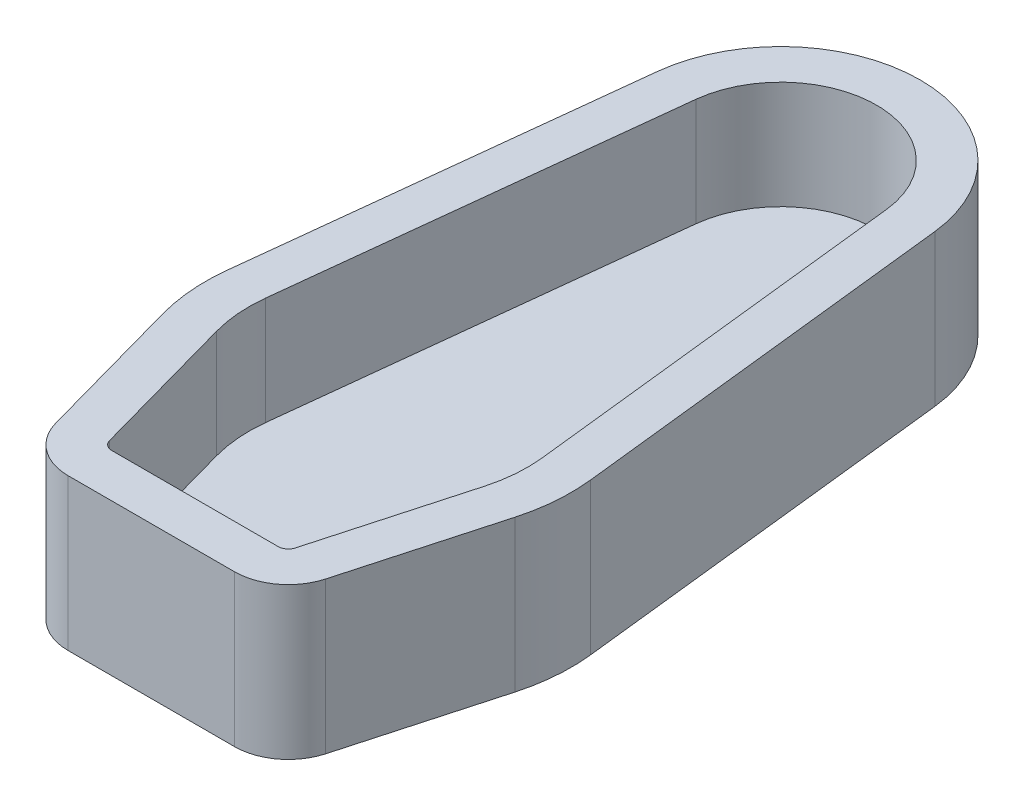
ISO-10303-21;
HEADER;
FILE_DESCRIPTION(('STEP AP214'),'2;1');
FILE_NAME('part.step','',(''),(''),'','','');
FILE_SCHEMA(('AUTOMOTIVE_DESIGN { 1 0 10303 214 1 1 1 1 }'));
ENDSEC;
DATA;
#1=APPLICATION_CONTEXT('core data for automotive mechanical design processes');
#2=APPLICATION_PROTOCOL_DEFINITION('international standard','automotive_design',2000,#1);
#3=PRODUCT_CONTEXT('',#1,'mechanical');
#4=PRODUCT('Part','Part','',(#3));
#5=PRODUCT_RELATED_PRODUCT_CATEGORY('part','',(#4));
#6=PRODUCT_DEFINITION_FORMATION('','',#4);
#7=PRODUCT_DEFINITION_CONTEXT('part definition',#1,'design');
#8=PRODUCT_DEFINITION('design','',#6,#7);
#9=PRODUCT_DEFINITION_SHAPE('','',#8);
#10=(LENGTH_UNIT() NAMED_UNIT(*) SI_UNIT(.MILLI.,.METRE.));
#11=(NAMED_UNIT(*) PLANE_ANGLE_UNIT() SI_UNIT($,.RADIAN.));
#12=(NAMED_UNIT(*) SI_UNIT($,.STERADIAN.) SOLID_ANGLE_UNIT());
#13=UNCERTAINTY_MEASURE_WITH_UNIT(LENGTH_MEASURE(1.E-05),#10,'distance_accuracy_value','');
#14=(GEOMETRIC_REPRESENTATION_CONTEXT(3) GLOBAL_UNCERTAINTY_ASSIGNED_CONTEXT((#13)) GLOBAL_UNIT_ASSIGNED_CONTEXT((#10,
#11,#12)) REPRESENTATION_CONTEXT('',''));
#15=CARTESIAN_POINT('',(0.,0.,0.));
#16=DIRECTION('',(0.,0.,1.));
#17=DIRECTION('',(1.,0.,0.));
#18=AXIS2_PLACEMENT_3D('',#15,#16,#17);
#19=CARTESIAN_POINT('',(0.,7.5,-14.5));
#20=DIRECTION('',(0.,-1.,0.));
#21=DIRECTION('',(0.,0.,-1.));
#22=AXIS2_PLACEMENT_3D('',#19,#20,#21);
#23=CYLINDRICAL_SURFACE('',#22,6.91000000000001);
#24=CARTESIAN_POINT('',(0.,0.,-14.5));
#25=DIRECTION('',(0.,1.,0.));
#26=DIRECTION('',(0.,0.,1.));
#27=AXIS2_PLACEMENT_3D('',#24,#25,#26);
#28=CIRCLE('',#27,6.91000000000001);
#29=CARTESIAN_POINT('',(6.86778996272424,0.,-15.2626014869535));
#30=VERTEX_POINT('',#29);
#31=CARTESIAN_POINT('',(-6.86778996272433,0.,-15.2626014869535));
#32=VERTEX_POINT('',#31);
#33=EDGE_CURVE('E154',#30,#32,#28,.T.);
#34=ORIENTED_EDGE('',*,*,#33,.T.);
#35=DIRECTION('',(0.,-1.,0.));
#36=VECTOR('',#35,1.);
#37=CARTESIAN_POINT('',(-6.86778996272433,7.5,-15.2626014869535));
#38=LINE('',#37,#36);
#39=CARTESIAN_POINT('',(-6.86778996272433,7.5,-15.2626014869535));
#40=VERTEX_POINT('',#39);
#41=EDGE_CURVE('E11',#40,#32,#38,.T.);
#42=ORIENTED_EDGE('',*,*,#41,.F.);
#43=CARTESIAN_POINT('',(0.,7.5,-14.5));
#44=DIRECTION('',(0.,1.,0.));
#45=DIRECTION('',(0.,0.,1.));
#46=AXIS2_PLACEMENT_3D('',#43,#44,#45);
#47=CIRCLE('',#46,6.91000000000001);
#48=CARTESIAN_POINT('',(6.86778996272424,7.5,-15.2626014869535));
#49=VERTEX_POINT('',#48);
#50=EDGE_CURVE('E178',#49,#40,#47,.T.);
#51=ORIENTED_EDGE('',*,*,#50,.F.);
#52=DIRECTION('',(0.,-1.,0.));
#53=VECTOR('',#52,1.);
#54=CARTESIAN_POINT('',(6.86778996272424,7.5,-15.2626014869535));
#55=LINE('',#54,#53);
#56=EDGE_CURVE('E56',#49,#30,#55,.T.);
#57=ORIENTED_EDGE('',*,*,#56,.T.);
#58=EDGE_LOOP('',(#34,#42,#51,#57));
#59=FACE_BOUND('',#58,.T.);
#60=ADVANCED_FACE('F33',(#59),#23,.T.);
#61=CARTESIAN_POINT('',(-6.86778996272433,7.5,-15.2626014869535));
#62=DIRECTION('',(0.993891456255322,0.,0.110362009689359));
#63=DIRECTION('',(0.110362009689359,0.,-0.993891456255323));
#64=AXIS2_PLACEMENT_3D('',#61,#62,#63);
#65=PLANE('',#64);
#66=DIRECTION('',(-0.110362009689359,0.,0.993891456255322));
#67=VECTOR('',#66,1.);
#68=CARTESIAN_POINT('',(-6.86778996272433,0.,-15.2626014869535));
#69=LINE('',#68,#67);
#70=CARTESIAN_POINT('',(-8.99761732756001,0.,3.91806790432763));
#71=VERTEX_POINT('',#70);
#72=EDGE_CURVE('E156',#32,#71,#69,.T.);
#73=ORIENTED_EDGE('',*,*,#72,.T.);
#74=DIRECTION('',(0.,-1.,0.));
#75=VECTOR('',#74,1.);
#76=CARTESIAN_POINT('',(-8.99761732756001,7.5,3.91806790432763));
#77=LINE('',#76,#75);
#78=CARTESIAN_POINT('',(-8.99761732756001,7.5,3.91806790432763));
#79=VERTEX_POINT('',#78);
#80=EDGE_CURVE('E40',#79,#71,#77,.T.);
#81=ORIENTED_EDGE('',*,*,#80,.F.);
#82=DIRECTION('',(-0.110362009689359,0.,0.993891456255322));
#83=VECTOR('',#82,1.);
#84=CARTESIAN_POINT('',(-6.86778996272433,7.5,-15.2626014869535));
#85=LINE('',#84,#83);
#86=EDGE_CURVE('E101',#40,#79,#85,.T.);
#87=ORIENTED_EDGE('',*,*,#86,.F.);
#88=ORIENTED_EDGE('',*,*,#41,.T.);
#89=EDGE_LOOP('',(#73,#81,#87,#88));
#90=FACE_BOUND('',#89,.T.);
#91=ADVANCED_FACE('F226',(#90),#65,.F.);
#92=CARTESIAN_POINT('',(0.106428411738743,7.5,4.92898391308223));
#93=DIRECTION('',(0.,-1.,0.));
#94=DIRECTION('',(0.,0.,-1.));
#95=AXIS2_PLACEMENT_3D('',#92,#93,#94);
#96=CYLINDRICAL_SURFACE('',#95,9.16);
#97=CARTESIAN_POINT('',(0.106428411738743,0.,4.92898391308223));
#98=DIRECTION('',(0.,1.,0.));
#99=DIRECTION('',(0.,0.,1.));
#100=AXIS2_PLACEMENT_3D('',#97,#98,#99);
#101=CIRCLE('',#100,9.16);
#102=CARTESIAN_POINT('',(-8.71939564047149,0.,7.38060170536294));
#103=VERTEX_POINT('',#102);
#104=EDGE_CURVE('E159',#71,#103,#101,.T.);
#105=ORIENTED_EDGE('',*,*,#104,.T.);
#106=DIRECTION('',(0.,-1.,0.));
#107=VECTOR('',#106,1.);
#108=CARTESIAN_POINT('',(-8.71939564047149,7.5,7.38060170536294));
#109=LINE('',#108,#107);
#110=CARTESIAN_POINT('',(-8.71939564047149,7.5,7.38060170536294));
#111=VERTEX_POINT('',#110);
#112=EDGE_CURVE('E189',#111,#103,#109,.T.);
#113=ORIENTED_EDGE('',*,*,#112,.F.);
#114=CARTESIAN_POINT('',(0.106428411738743,7.5,4.92898391308223));
#115=DIRECTION('',(0.,1.,0.));
#116=DIRECTION('',(0.,0.,1.));
#117=AXIS2_PLACEMENT_3D('',#114,#115,#116);
#118=CIRCLE('',#117,9.16);
#119=EDGE_CURVE('E196',#79,#111,#118,.T.);
#120=ORIENTED_EDGE('',*,*,#119,.F.);
#121=ORIENTED_EDGE('',*,*,#80,.T.);
#122=EDGE_LOOP('',(#105,#113,#120,#121));
#123=FACE_BOUND('',#122,.T.);
#124=ADVANCED_FACE('F194',(#123),#96,.T.);
#125=CARTESIAN_POINT('',(-6.68291481483034,7.5,14.711932677671));
#126=DIRECTION('',(-0.96351790962994,0.,0.267643863786098));
#127=DIRECTION('',(0.267643863786098,0.,0.96351790962994));
#128=AXIS2_PLACEMENT_3D('',#125,#126,#127);
#129=PLANE('',#128);
#130=DIRECTION('',(-0.267643863786098,0.,-0.96351790962994));
#131=VECTOR('',#130,1.);
#132=CARTESIAN_POINT('',(-6.68291481483034,0.,14.711932677671));
#133=LINE('',#132,#131);
#134=CARTESIAN_POINT('',(-6.68291481483034,0.,14.711932677671));
#135=VERTEX_POINT('',#134);
#136=EDGE_CURVE('E162',#135,#103,#133,.T.);
#137=ORIENTED_EDGE('',*,*,#136,.F.);
#138=DIRECTION('',(0.,-1.,0.));
#139=VECTOR('',#138,1.);
#140=CARTESIAN_POINT('',(-6.68291481483034,7.5,14.711932677671));
#141=LINE('',#140,#139);
#142=CARTESIAN_POINT('',(-6.68291481483034,7.5,14.711932677671));
#143=VERTEX_POINT('',#142);
#144=EDGE_CURVE('E187',#143,#135,#141,.T.);
#145=ORIENTED_EDGE('',*,*,#144,.F.);
#146=DIRECTION('',(-0.267643863786098,0.,-0.96351790962994));
#147=VECTOR('',#146,1.);
#148=CARTESIAN_POINT('',(-6.68291481483034,7.5,14.711932677671));
#149=LINE('',#148,#147);
#150=EDGE_CURVE('E206',#143,#111,#149,.T.);
#151=ORIENTED_EDGE('',*,*,#150,.T.);
#152=ORIENTED_EDGE('',*,*,#112,.T.);
#153=EDGE_LOOP('',(#137,#145,#151,#152));
#154=FACE_BOUND('',#153,.T.);
#155=ADVANCED_FACE('F203',(#154),#129,.T.);
#156=CARTESIAN_POINT('',(-4.11995717521469,7.5,14.));
#157=DIRECTION('',(0.,-1.,0.));
#158=DIRECTION('',(0.,0.,-1.));
#159=AXIS2_PLACEMENT_3D('',#156,#157,#158);
#160=CYLINDRICAL_SURFACE('',#159,2.66);
#161=CARTESIAN_POINT('',(-4.11995717521469,0.,14.));
#162=DIRECTION('',(0.,-1.,0.));
#163=DIRECTION('',(0.,0.,-1.));
#164=AXIS2_PLACEMENT_3D('',#161,#162,#163);
#165=CIRCLE('',#164,2.66);
#166=CARTESIAN_POINT('',(-4.11995717521468,0.,16.66));
#167=VERTEX_POINT('',#166);
#168=EDGE_CURVE('E165',#167,#135,#165,.T.);
#169=ORIENTED_EDGE('',*,*,#168,.F.);
#170=DIRECTION('',(0.,-1.,0.));
#171=VECTOR('',#170,1.);
#172=CARTESIAN_POINT('',(-4.11995717521468,7.5,16.66));
#173=LINE('',#172,#171);
#174=CARTESIAN_POINT('',(-4.11995717521468,7.5,16.66));
#175=VERTEX_POINT('',#174);
#176=EDGE_CURVE('E185',#175,#167,#173,.T.);
#177=ORIENTED_EDGE('',*,*,#176,.F.);
#178=CARTESIAN_POINT('',(-4.11995717521469,7.5,14.));
#179=DIRECTION('',(0.,-1.,0.));
#180=DIRECTION('',(0.,0.,-1.));
#181=AXIS2_PLACEMENT_3D('',#178,#179,#180);
#182=CIRCLE('',#181,2.66);
#183=EDGE_CURVE('E209',#175,#143,#182,.T.);
#184=ORIENTED_EDGE('',*,*,#183,.T.);
#185=ORIENTED_EDGE('',*,*,#144,.T.);
#186=EDGE_LOOP('',(#169,#177,#184,#185));
#187=FACE_BOUND('',#186,.T.);
#188=ADVANCED_FACE('F236',(#187),#160,.T.);
#189=CARTESIAN_POINT('',(-4.11995717521468,7.5,16.66));
#190=DIRECTION('',(0.,0.,-1.));
#191=DIRECTION('',(-1.,0.,0.));
#192=AXIS2_PLACEMENT_3D('',#189,#190,#191);
#193=PLANE('',#192);
#194=DIRECTION('',(1.,0.,0.));
#195=VECTOR('',#194,1.);
#196=CARTESIAN_POINT('',(-4.11995717521468,0.,16.66));
#197=LINE('',#196,#195);
#198=CARTESIAN_POINT('',(4.11995717521476,0.,16.66));
#199=VERTEX_POINT('',#198);
#200=EDGE_CURVE('E168',#167,#199,#197,.T.);
#201=ORIENTED_EDGE('',*,*,#200,.T.);
#202=DIRECTION('',(0.,-1.,0.));
#203=VECTOR('',#202,1.);
#204=CARTESIAN_POINT('',(4.11995717521476,7.5,16.66));
#205=LINE('',#204,#203);
#206=CARTESIAN_POINT('',(4.11995717521476,7.5,16.66));
#207=VERTEX_POINT('',#206);
#208=EDGE_CURVE('E182',#207,#199,#205,.T.);
#209=ORIENTED_EDGE('',*,*,#208,.F.);
#210=DIRECTION('',(1.,0.,0.));
#211=VECTOR('',#210,1.);
#212=CARTESIAN_POINT('',(-4.11995717521468,7.5,16.66));
#213=LINE('',#212,#211);
#214=EDGE_CURVE('E211',#175,#207,#213,.T.);
#215=ORIENTED_EDGE('',*,*,#214,.F.);
#216=ORIENTED_EDGE('',*,*,#176,.T.);
#217=EDGE_LOOP('',(#201,#209,#215,#216));
#218=FACE_BOUND('',#217,.T.);
#219=ADVANCED_FACE('F219',(#218),#193,.F.);
#220=CARTESIAN_POINT('',(4.11995717521479,7.5,14.));
#221=DIRECTION('',(0.,-1.,0.));
#222=DIRECTION('',(0.,0.,-1.));
#223=AXIS2_PLACEMENT_3D('',#220,#221,#222);
#224=CYLINDRICAL_SURFACE('',#223,2.66);
#225=CARTESIAN_POINT('',(4.11995717521479,0.,14.));
#226=DIRECTION('',(0.,1.,0.));
#227=DIRECTION('',(0.,0.,1.));
#228=AXIS2_PLACEMENT_3D('',#225,#226,#227);
#229=CIRCLE('',#228,2.66);
#230=CARTESIAN_POINT('',(6.68291481483043,0.,14.711932677671));
#231=VERTEX_POINT('',#230);
#232=EDGE_CURVE('E170',#199,#231,#229,.T.);
#233=ORIENTED_EDGE('',*,*,#232,.T.);
#234=DIRECTION('',(0.,-1.,0.));
#235=VECTOR('',#234,1.);
#236=CARTESIAN_POINT('',(6.68291481483043,7.5,14.711932677671));
#237=LINE('',#236,#235);
#238=CARTESIAN_POINT('',(6.68291481483043,7.5,14.711932677671));
#239=VERTEX_POINT('',#238);
#240=EDGE_CURVE('E145',#239,#231,#237,.T.);
#241=ORIENTED_EDGE('',*,*,#240,.F.);
#242=CARTESIAN_POINT('',(4.11995717521479,7.5,14.));
#243=DIRECTION('',(0.,1.,0.));
#244=DIRECTION('',(0.,0.,1.));
#245=AXIS2_PLACEMENT_3D('',#242,#243,#244);
#246=CIRCLE('',#245,2.66);
#247=EDGE_CURVE('E132',#207,#239,#246,.T.);
#248=ORIENTED_EDGE('',*,*,#247,.F.);
#249=ORIENTED_EDGE('',*,*,#208,.T.);
#250=EDGE_LOOP('',(#233,#241,#248,#249));
#251=FACE_BOUND('',#250,.T.);
#252=ADVANCED_FACE('F222',(#251),#224,.T.);
#253=CARTESIAN_POINT('',(6.68291481483043,7.5,14.711932677671));
#254=DIRECTION('',(-0.963517909629941,0.,-0.267643863786092));
#255=DIRECTION('',(-0.267643863786092,0.,0.963517909629941));
#256=AXIS2_PLACEMENT_3D('',#253,#254,#255);
#257=PLANE('',#256);
#258=DIRECTION('',(0.267643863786092,0.,-0.963517909629941));
#259=VECTOR('',#258,1.);
#260=CARTESIAN_POINT('',(6.68291481483043,0.,14.711932677671));
#261=LINE('',#260,#259);
#262=CARTESIAN_POINT('',(8.71939564047153,0.,7.38060170536297));
#263=VERTEX_POINT('',#262);
#264=EDGE_CURVE('E141',#231,#263,#261,.T.);
#265=ORIENTED_EDGE('',*,*,#264,.T.);
#266=DIRECTION('',(0.,-1.,0.));
#267=VECTOR('',#266,1.);
#268=CARTESIAN_POINT('',(8.71939564047153,7.5,7.38060170536297));
#269=LINE('',#268,#267);
#270=CARTESIAN_POINT('',(8.71939564047153,7.5,7.38060170536297));
#271=VERTEX_POINT('',#270);
#272=EDGE_CURVE('E138',#271,#263,#269,.T.);
#273=ORIENTED_EDGE('',*,*,#272,.F.);
#274=DIRECTION('',(0.267643863786092,0.,-0.963517909629941));
#275=VECTOR('',#274,1.);
#276=CARTESIAN_POINT('',(6.68291481483043,7.5,14.711932677671));
#277=LINE('',#276,#275);
#278=EDGE_CURVE('E124',#239,#271,#277,.T.);
#279=ORIENTED_EDGE('',*,*,#278,.F.);
#280=ORIENTED_EDGE('',*,*,#240,.T.);
#281=EDGE_LOOP('',(#265,#273,#279,#280));
#282=FACE_BOUND('',#281,.T.);
#283=ADVANCED_FACE('F139',(#282),#257,.F.);
#284=CARTESIAN_POINT('',(-0.106428411738709,7.5,4.92898391308228));
#285=DIRECTION('',(0.,-1.,0.));
#286=DIRECTION('',(0.,0.,-1.));
#287=AXIS2_PLACEMENT_3D('',#284,#285,#286);
#288=CYLINDRICAL_SURFACE('',#287,9.16);
#289=CARTESIAN_POINT('',(-0.106428411738709,0.,4.92898391308228));
#290=DIRECTION('',(0.,1.,0.));
#291=DIRECTION('',(0.,0.,1.));
#292=AXIS2_PLACEMENT_3D('',#289,#290,#291);
#293=CIRCLE('',#292,9.16);
#294=CARTESIAN_POINT('',(8.99761732756004,0.,3.91806790432761));
#295=VERTEX_POINT('',#294);
#296=EDGE_CURVE('E173',#263,#295,#293,.T.);
#297=ORIENTED_EDGE('',*,*,#296,.T.);
#298=DIRECTION('',(0.,-1.,0.));
#299=VECTOR('',#298,1.);
#300=CARTESIAN_POINT('',(8.99761732756004,7.5,3.91806790432761));
#301=LINE('',#300,#299);
#302=CARTESIAN_POINT('',(8.99761732756004,7.5,3.91806790432761));
#303=VERTEX_POINT('',#302);
#304=EDGE_CURVE('E146',#303,#295,#301,.T.);
#305=ORIENTED_EDGE('',*,*,#304,.F.);
#306=CARTESIAN_POINT('',(-0.106428411738709,7.5,4.92898391308228));
#307=DIRECTION('',(0.,1.,0.));
#308=DIRECTION('',(0.,0.,1.));
#309=AXIS2_PLACEMENT_3D('',#306,#307,#308);
#310=CIRCLE('',#309,9.16);
#311=EDGE_CURVE('E129',#271,#303,#310,.T.);
#312=ORIENTED_EDGE('',*,*,#311,.F.);
#313=ORIENTED_EDGE('',*,*,#272,.T.);
#314=EDGE_LOOP('',(#297,#305,#312,#313));
#315=FACE_BOUND('',#314,.T.);
#316=ADVANCED_FACE('F148',(#315),#288,.T.);
#317=CARTESIAN_POINT('',(6.86778996272424,7.5,-15.2626014869535));
#318=DIRECTION('',(0.993891456255322,0.,-0.110362009689366));
#319=DIRECTION('',(-0.110362009689366,0.,-0.993891456255322));
#320=AXIS2_PLACEMENT_3D('',#317,#318,#319);
#321=PLANE('',#320);
#322=DIRECTION('',(0.110362009689366,0.,0.993891456255322));
#323=VECTOR('',#322,1.);
#324=CARTESIAN_POINT('',(6.86778996272424,0.,-15.2626014869535));
#325=LINE('',#324,#323);
#326=EDGE_CURVE('E175',#30,#295,#325,.T.);
#327=ORIENTED_EDGE('',*,*,#326,.F.);
#328=ORIENTED_EDGE('',*,*,#56,.F.);
#329=DIRECTION('',(0.110362009689366,0.,0.993891456255322));
#330=VECTOR('',#329,1.);
#331=CARTESIAN_POINT('',(6.86778996272424,7.5,-15.2626014869535));
#332=LINE('',#331,#330);
#333=EDGE_CURVE('E149',#49,#303,#332,.T.);
#334=ORIENTED_EDGE('',*,*,#333,.T.);
#335=ORIENTED_EDGE('',*,*,#304,.T.);
#336=EDGE_LOOP('',(#327,#328,#334,#335));
#337=FACE_BOUND('',#336,.T.);
#338=ADVANCED_FACE('F223',(#337),#321,.T.);
#339=CARTESIAN_POINT('',(0.,7.5,-14.5));
#340=DIRECTION('',(0.,1.,0.));
#341=DIRECTION('',(0.,0.,1.));
#342=AXIS2_PLACEMENT_3D('',#339,#340,#341);
#343=PLANE('',#342);
#344=CARTESIAN_POINT('',(0.,7.5,-14.5));
#345=DIRECTION('',(0.,1.,0.));
#346=DIRECTION('',(0.,0.,1.));
#347=AXIS2_PLACEMENT_3D('',#344,#345,#346);
#348=CIRCLE('',#347,4.75000000000001);
#349=CARTESIAN_POINT('',(4.72098441721274,7.5,-15.0242195460245));
#350=VERTEX_POINT('',#349);
#351=CARTESIAN_POINT('',(-4.72098441721284,7.5,-15.0242195460245));
#352=VERTEX_POINT('',#351);
#353=EDGE_CURVE('E322',#350,#352,#348,.T.);
#354=ORIENTED_EDGE('',*,*,#353,.F.);
#355=DIRECTION('',(0.110362009689366,0.,0.993891456255322));
#356=VECTOR('',#355,1.);
#357=CARTESIAN_POINT('',(4.72098441721274,7.5,-15.0242195460245));
#358=LINE('',#357,#356);
#359=CARTESIAN_POINT('',(6.85081178204854,7.5,4.15644984525666));
#360=VERTEX_POINT('',#359);
#361=EDGE_CURVE('E352',#350,#360,#358,.T.);
#362=ORIENTED_EDGE('',*,*,#361,.T.);
#363=CARTESIAN_POINT('',(-0.106428411738709,7.5,4.92898391308228));
#364=DIRECTION('',(0.,1.,0.));
#365=DIRECTION('',(0.,0.,1.));
#366=AXIS2_PLACEMENT_3D('',#363,#364,#365);
#367=CIRCLE('',#366,7.);
#368=CARTESIAN_POINT('',(6.63819695567085,7.5,6.80249095958501));
#369=VERTEX_POINT('',#368);
#370=EDGE_CURVE('E350',#369,#360,#367,.T.);
#371=ORIENTED_EDGE('',*,*,#370,.F.);
#372=DIRECTION('',(0.267643863786092,0.,-0.963517909629941));
#373=VECTOR('',#372,1.);
#374=CARTESIAN_POINT('',(4.60171613002976,7.5,14.133821931893));
#375=LINE('',#374,#373);
#376=CARTESIAN_POINT('',(4.60171613002976,7.5,14.133821931893));
#377=VERTEX_POINT('',#376);
#378=EDGE_CURVE('E347',#377,#369,#375,.T.);
#379=ORIENTED_EDGE('',*,*,#378,.F.);
#380=CARTESIAN_POINT('',(4.11995717521479,7.5,14.));
#381=DIRECTION('',(0.,1.,0.));
#382=DIRECTION('',(0.,0.,1.));
#383=AXIS2_PLACEMENT_3D('',#380,#381,#382);
#384=CIRCLE('',#383,0.500000000000001);
#385=CARTESIAN_POINT('',(4.11995717521476,7.5,14.5));
#386=VERTEX_POINT('',#385);
#387=EDGE_CURVE('E344',#386,#377,#384,.T.);
#388=ORIENTED_EDGE('',*,*,#387,.F.);
#389=DIRECTION('',(1.,0.,0.));
#390=VECTOR('',#389,1.);
#391=CARTESIAN_POINT('',(-4.11995717521468,7.5,14.5));
#392=LINE('',#391,#390);
#393=CARTESIAN_POINT('',(-4.11995717521469,7.5,14.5));
#394=VERTEX_POINT('',#393);
#395=EDGE_CURVE('E341',#394,#386,#392,.T.);
#396=ORIENTED_EDGE('',*,*,#395,.F.);
#397=CARTESIAN_POINT('',(-4.11995717521469,7.5,14.));
#398=DIRECTION('',(0.,1.,0.));
#399=DIRECTION('',(0.,0.,1.));
#400=AXIS2_PLACEMENT_3D('',#397,#398,#399);
#401=CIRCLE('',#400,0.500000000000001);
#402=CARTESIAN_POINT('',(-4.60171613002967,7.5,14.133821931893));
#403=VERTEX_POINT('',#402);
#404=EDGE_CURVE('E338',#394,#403,#401,.F.);
#405=ORIENTED_EDGE('',*,*,#404,.T.);
#406=DIRECTION('',(-0.267643863786098,0.,-0.96351790962994));
#407=VECTOR('',#406,1.);
#408=CARTESIAN_POINT('',(-4.60171613002967,7.5,14.133821931893));
#409=LINE('',#408,#407);
#410=CARTESIAN_POINT('',(-6.63819695567082,7.5,6.80249095958496));
#411=VERTEX_POINT('',#410);
#412=EDGE_CURVE('E335',#403,#411,#409,.T.);
#413=ORIENTED_EDGE('',*,*,#412,.T.);
#414=CARTESIAN_POINT('',(0.106428411738743,7.5,4.92898391308223));
#415=DIRECTION('',(0.,1.,0.));
#416=DIRECTION('',(0.,0.,1.));
#417=AXIS2_PLACEMENT_3D('',#414,#415,#416);
#418=CIRCLE('',#417,7.);
#419=CARTESIAN_POINT('',(-6.85081178204851,7.5,4.15644984525665));
#420=VERTEX_POINT('',#419);
#421=EDGE_CURVE('E332',#420,#411,#418,.T.);
#422=ORIENTED_EDGE('',*,*,#421,.F.);
#423=DIRECTION('',(-0.110362009689359,0.,0.993891456255323));
#424=VECTOR('',#423,1.);
#425=CARTESIAN_POINT('',(-4.72098441721284,7.5,-15.0242195460245));
#426=LINE('',#425,#424);
#427=EDGE_CURVE('E324',#352,#420,#426,.T.);
#428=ORIENTED_EDGE('',*,*,#427,.F.);
#429=EDGE_LOOP('',(#354,#362,#371,#379,#388,#396,#405,#413,#422,#428));
#430=FACE_BOUND('',#429,.T.);
#431=ORIENTED_EDGE('',*,*,#50,.T.);
#432=ORIENTED_EDGE('',*,*,#86,.T.);
#433=ORIENTED_EDGE('',*,*,#119,.T.);
#434=ORIENTED_EDGE('',*,*,#150,.F.);
#435=ORIENTED_EDGE('',*,*,#183,.F.);
#436=ORIENTED_EDGE('',*,*,#214,.T.);
#437=ORIENTED_EDGE('',*,*,#247,.T.);
#438=ORIENTED_EDGE('',*,*,#278,.T.);
#439=ORIENTED_EDGE('',*,*,#311,.T.);
#440=ORIENTED_EDGE('',*,*,#333,.F.);
#441=EDGE_LOOP('',(#431,#432,#433,#434,#435,#436,#437,#438,#439,#440));
#442=FACE_BOUND('',#441,.T.);
#443=ADVANCED_FACE('F126',(#430,#442),#343,.T.);
#444=CARTESIAN_POINT('',(0.,0.,-14.5));
#445=DIRECTION('',(0.,1.,0.));
#446=DIRECTION('',(0.,0.,1.));
#447=AXIS2_PLACEMENT_3D('',#444,#445,#446);
#448=PLANE('',#447);
#449=ORIENTED_EDGE('',*,*,#33,.F.);
#450=ORIENTED_EDGE('',*,*,#326,.T.);
#451=ORIENTED_EDGE('',*,*,#296,.F.);
#452=ORIENTED_EDGE('',*,*,#264,.F.);
#453=ORIENTED_EDGE('',*,*,#232,.F.);
#454=ORIENTED_EDGE('',*,*,#200,.F.);
#455=ORIENTED_EDGE('',*,*,#168,.T.);
#456=ORIENTED_EDGE('',*,*,#136,.T.);
#457=ORIENTED_EDGE('',*,*,#104,.F.);
#458=ORIENTED_EDGE('',*,*,#72,.F.);
#459=EDGE_LOOP('',(#449,#450,#451,#452,#453,#454,#455,#456,#457,#458));
#460=FACE_BOUND('',#459,.T.);
#461=ADVANCED_FACE('F198',(#460),#448,.F.);
#462=CARTESIAN_POINT('',(0.,7.5,-14.5));
#463=DIRECTION('',(0.,-1.,0.));
#464=DIRECTION('',(0.,0.,-1.));
#465=AXIS2_PLACEMENT_3D('',#462,#463,#464);
#466=CYLINDRICAL_SURFACE('',#465,4.75000000000001);
#467=CARTESIAN_POINT('',(0.,2.16,-14.5));
#468=DIRECTION('',(0.,1.,0.));
#469=DIRECTION('',(0.,0.,1.));
#470=AXIS2_PLACEMENT_3D('',#467,#468,#469);
#471=CIRCLE('',#470,4.75000000000001);
#472=CARTESIAN_POINT('',(4.72098441721274,2.16,-15.0242195460245));
#473=VERTEX_POINT('',#472);
#474=CARTESIAN_POINT('',(-4.72098441721284,2.16,-15.0242195460245));
#475=VERTEX_POINT('',#474);
#476=EDGE_CURVE('E304',#473,#475,#471,.T.);
#477=ORIENTED_EDGE('',*,*,#476,.F.);
#478=DIRECTION('',(0.,-1.,0.));
#479=VECTOR('',#478,1.);
#480=CARTESIAN_POINT('',(4.72098441721274,7.5,-15.0242195460245));
#481=LINE('',#480,#479);
#482=EDGE_CURVE('E308',#350,#473,#481,.T.);
#483=ORIENTED_EDGE('',*,*,#482,.F.);
#484=ORIENTED_EDGE('',*,*,#353,.T.);
#485=DIRECTION('',(0.,1.,0.));
#486=VECTOR('',#485,1.);
#487=CARTESIAN_POINT('',(-4.72098441721284,7.5,-15.0242195460245));
#488=LINE('',#487,#486);
#489=EDGE_CURVE('E157',#352,#475,#488,.F.);
#490=ORIENTED_EDGE('',*,*,#489,.T.);
#491=EDGE_LOOP('',(#477,#483,#484,#490));
#492=FACE_BOUND('',#491,.T.);
#493=ADVANCED_FACE('F252',(#492),#466,.F.);
#494=CARTESIAN_POINT('',(-4.72098441721284,7.5,-15.0242195460245));
#495=DIRECTION('',(0.993891456255322,0.,0.110362009689359));
#496=DIRECTION('',(0.110362009689359,0.,-0.993891456255323));
#497=AXIS2_PLACEMENT_3D('',#494,#495,#496);
#498=PLANE('',#497);
#499=DIRECTION('',(-0.110362009689359,0.,0.993891456255323));
#500=VECTOR('',#499,1.);
#501=CARTESIAN_POINT('',(-4.72098441721284,2.16,-15.0242195460245));
#502=LINE('',#501,#500);
#503=CARTESIAN_POINT('',(-6.85081178204851,2.16,4.15644984525666));
#504=VERTEX_POINT('',#503);
#505=EDGE_CURVE('E315',#475,#504,#502,.T.);
#506=ORIENTED_EDGE('',*,*,#505,.F.);
#507=ORIENTED_EDGE('',*,*,#489,.F.);
#508=ORIENTED_EDGE('',*,*,#427,.T.);
#509=DIRECTION('',(0.,-1.,0.));
#510=VECTOR('',#509,1.);
#511=CARTESIAN_POINT('',(-6.85081178204851,7.5,4.15644984525666));
#512=LINE('',#511,#510);
#513=EDGE_CURVE('E362',#420,#504,#512,.T.);
#514=ORIENTED_EDGE('',*,*,#513,.T.);
#515=EDGE_LOOP('',(#506,#507,#508,#514));
#516=FACE_BOUND('',#515,.T.);
#517=ADVANCED_FACE('F290',(#516),#498,.T.);
#518=CARTESIAN_POINT('',(0.106428411738743,7.5,4.92898391308223));
#519=DIRECTION('',(0.,-1.,0.));
#520=DIRECTION('',(0.,0.,-1.));
#521=AXIS2_PLACEMENT_3D('',#518,#519,#520);
#522=CYLINDRICAL_SURFACE('',#521,7.);
#523=CARTESIAN_POINT('',(0.106428411738743,2.16,4.92898391308223));
#524=DIRECTION('',(0.,1.,0.));
#525=DIRECTION('',(0.,0.,1.));
#526=AXIS2_PLACEMENT_3D('',#523,#524,#525);
#527=CIRCLE('',#526,7.);
#528=CARTESIAN_POINT('',(-6.63819695567082,2.16,6.80249095958496));
#529=VERTEX_POINT('',#528);
#530=EDGE_CURVE('E361',#504,#529,#527,.T.);
#531=ORIENTED_EDGE('',*,*,#530,.F.);
#532=ORIENTED_EDGE('',*,*,#513,.F.);
#533=ORIENTED_EDGE('',*,*,#421,.T.);
#534=DIRECTION('',(0.,1.,0.));
#535=VECTOR('',#534,1.);
#536=CARTESIAN_POINT('',(-6.63819695567082,7.5,6.80249095958496));
#537=LINE('',#536,#535);
#538=EDGE_CURVE('E365',#411,#529,#537,.F.);
#539=ORIENTED_EDGE('',*,*,#538,.T.);
#540=EDGE_LOOP('',(#531,#532,#533,#539));
#541=FACE_BOUND('',#540,.T.);
#542=ADVANCED_FACE('F286',(#541),#522,.F.);
#543=CARTESIAN_POINT('',(-4.60171613002967,7.5,14.133821931893));
#544=DIRECTION('',(-0.96351790962994,0.,0.267643863786098));
#545=DIRECTION('',(0.267643863786098,0.,0.96351790962994));
#546=AXIS2_PLACEMENT_3D('',#543,#544,#545);
#547=PLANE('',#546);
#548=DIRECTION('',(-0.267643863786098,0.,-0.96351790962994));
#549=VECTOR('',#548,1.);
#550=CARTESIAN_POINT('',(-4.60171613002967,2.16,14.133821931893));
#551=LINE('',#550,#549);
#552=CARTESIAN_POINT('',(-4.60171613002966,2.16,14.133821931893));
#553=VERTEX_POINT('',#552);
#554=EDGE_CURVE('E368',#553,#529,#551,.T.);
#555=ORIENTED_EDGE('',*,*,#554,.T.);
#556=ORIENTED_EDGE('',*,*,#538,.F.);
#557=ORIENTED_EDGE('',*,*,#412,.F.);
#558=DIRECTION('',(0.,-1.,0.));
#559=VECTOR('',#558,1.);
#560=CARTESIAN_POINT('',(-4.60171613002966,7.5,14.133821931893));
#561=LINE('',#560,#559);
#562=EDGE_CURVE('E371',#403,#553,#561,.T.);
#563=ORIENTED_EDGE('',*,*,#562,.T.);
#564=EDGE_LOOP('',(#555,#556,#557,#563));
#565=FACE_BOUND('',#564,.T.);
#566=ADVANCED_FACE('F282',(#565),#547,.F.);
#567=CARTESIAN_POINT('',(-4.11995717521469,7.5,14.));
#568=DIRECTION('',(0.,-1.,0.));
#569=DIRECTION('',(0.,0.,-1.));
#570=AXIS2_PLACEMENT_3D('',#567,#568,#569);
#571=CYLINDRICAL_SURFACE('',#570,0.500000000000001);
#572=CARTESIAN_POINT('',(-4.11995717521469,2.16,14.));
#573=DIRECTION('',(0.,1.,0.));
#574=DIRECTION('',(0.,0.,1.));
#575=AXIS2_PLACEMENT_3D('',#572,#573,#574);
#576=CIRCLE('',#575,0.500000000000001);
#577=CARTESIAN_POINT('',(-4.11995717521468,2.16,14.5));
#578=VERTEX_POINT('',#577);
#579=EDGE_CURVE('E374',#578,#553,#576,.F.);
#580=ORIENTED_EDGE('',*,*,#579,.T.);
#581=ORIENTED_EDGE('',*,*,#562,.F.);
#582=ORIENTED_EDGE('',*,*,#404,.F.);
#583=DIRECTION('',(0.,1.,0.));
#584=VECTOR('',#583,1.);
#585=CARTESIAN_POINT('',(-4.11995717521468,7.5,14.5));
#586=LINE('',#585,#584);
#587=EDGE_CURVE('E377',#394,#578,#586,.F.);
#588=ORIENTED_EDGE('',*,*,#587,.T.);
#589=EDGE_LOOP('',(#580,#581,#582,#588));
#590=FACE_BOUND('',#589,.T.);
#591=ADVANCED_FACE('F278',(#590),#571,.F.);
#592=CARTESIAN_POINT('',(-4.11995717521468,7.5,14.5));
#593=DIRECTION('',(0.,0.,-1.));
#594=DIRECTION('',(-1.,0.,0.));
#595=AXIS2_PLACEMENT_3D('',#592,#593,#594);
#596=PLANE('',#595);
#597=DIRECTION('',(1.,0.,0.));
#598=VECTOR('',#597,1.);
#599=CARTESIAN_POINT('',(-4.11995717521468,2.16,14.5));
#600=LINE('',#599,#598);
#601=CARTESIAN_POINT('',(4.11995717521478,2.16,14.5));
#602=VERTEX_POINT('',#601);
#603=EDGE_CURVE('E380',#578,#602,#600,.T.);
#604=ORIENTED_EDGE('',*,*,#603,.F.);
#605=ORIENTED_EDGE('',*,*,#587,.F.);
#606=ORIENTED_EDGE('',*,*,#395,.T.);
#607=DIRECTION('',(0.,-1.,0.));
#608=VECTOR('',#607,1.);
#609=CARTESIAN_POINT('',(4.11995717521478,7.5,14.5));
#610=LINE('',#609,#608);
#611=EDGE_CURVE('E383',#386,#602,#610,.T.);
#612=ORIENTED_EDGE('',*,*,#611,.T.);
#613=EDGE_LOOP('',(#604,#605,#606,#612));
#614=FACE_BOUND('',#613,.T.);
#615=ADVANCED_FACE('F274',(#614),#596,.T.);
#616=CARTESIAN_POINT('',(4.11995717521479,7.5,14.));
#617=DIRECTION('',(0.,-1.,0.));
#618=DIRECTION('',(0.,0.,-1.));
#619=AXIS2_PLACEMENT_3D('',#616,#617,#618);
#620=CYLINDRICAL_SURFACE('',#619,0.500000000000001);
#621=CARTESIAN_POINT('',(4.11995717521479,2.16,14.));
#622=DIRECTION('',(0.,1.,0.));
#623=DIRECTION('',(0.,0.,1.));
#624=AXIS2_PLACEMENT_3D('',#621,#622,#623);
#625=CIRCLE('',#624,0.500000000000001);
#626=CARTESIAN_POINT('',(4.60171613002976,2.16,14.133821931893));
#627=VERTEX_POINT('',#626);
#628=EDGE_CURVE('E386',#602,#627,#625,.T.);
#629=ORIENTED_EDGE('',*,*,#628,.F.);
#630=ORIENTED_EDGE('',*,*,#611,.F.);
#631=ORIENTED_EDGE('',*,*,#387,.T.);
#632=DIRECTION('',(0.,1.,0.));
#633=VECTOR('',#632,1.);
#634=CARTESIAN_POINT('',(4.60171613002976,7.5,14.133821931893));
#635=LINE('',#634,#633);
#636=EDGE_CURVE('E389',#377,#627,#635,.F.);
#637=ORIENTED_EDGE('',*,*,#636,.T.);
#638=EDGE_LOOP('',(#629,#630,#631,#637));
#639=FACE_BOUND('',#638,.T.);
#640=ADVANCED_FACE('F270',(#639),#620,.F.);
#641=CARTESIAN_POINT('',(4.60171613002976,7.5,14.133821931893));
#642=DIRECTION('',(-0.963517909629941,0.,-0.267643863786092));
#643=DIRECTION('',(-0.267643863786092,0.,0.963517909629941));
#644=AXIS2_PLACEMENT_3D('',#641,#642,#643);
#645=PLANE('',#644);
#646=DIRECTION('',(0.267643863786092,0.,-0.963517909629941));
#647=VECTOR('',#646,1.);
#648=CARTESIAN_POINT('',(4.60171613002976,2.16,14.133821931893));
#649=LINE('',#648,#647);
#650=CARTESIAN_POINT('',(6.63819695567086,2.16,6.80249095958499));
#651=VERTEX_POINT('',#650);
#652=EDGE_CURVE('E326',#627,#651,#649,.T.);
#653=ORIENTED_EDGE('',*,*,#652,.F.);
#654=ORIENTED_EDGE('',*,*,#636,.F.);
#655=ORIENTED_EDGE('',*,*,#378,.T.);
#656=DIRECTION('',(0.,-1.,0.));
#657=VECTOR('',#656,1.);
#658=CARTESIAN_POINT('',(6.63819695567086,7.5,6.80249095958499));
#659=LINE('',#658,#657);
#660=EDGE_CURVE('E357',#369,#651,#659,.T.);
#661=ORIENTED_EDGE('',*,*,#660,.T.);
#662=EDGE_LOOP('',(#653,#654,#655,#661));
#663=FACE_BOUND('',#662,.T.);
#664=ADVANCED_FACE('F266',(#663),#645,.T.);
#665=CARTESIAN_POINT('',(-0.106428411738709,7.5,4.92898391308228));
#666=DIRECTION('',(0.,-1.,0.));
#667=DIRECTION('',(0.,0.,-1.));
#668=AXIS2_PLACEMENT_3D('',#665,#666,#667);
#669=CYLINDRICAL_SURFACE('',#668,7.);
#670=CARTESIAN_POINT('',(-0.106428411738709,2.16,4.92898391308228));
#671=DIRECTION('',(0.,1.,0.));
#672=DIRECTION('',(0.,0.,1.));
#673=AXIS2_PLACEMENT_3D('',#670,#671,#672);
#674=CIRCLE('',#673,7.);
#675=CARTESIAN_POINT('',(6.85081178204855,2.16,4.15644984525664));
#676=VERTEX_POINT('',#675);
#677=EDGE_CURVE('E321',#651,#676,#674,.T.);
#678=ORIENTED_EDGE('',*,*,#677,.F.);
#679=ORIENTED_EDGE('',*,*,#660,.F.);
#680=ORIENTED_EDGE('',*,*,#370,.T.);
#681=DIRECTION('',(0.,1.,0.));
#682=VECTOR('',#681,1.);
#683=CARTESIAN_POINT('',(6.85081178204855,7.5,4.15644984525664));
#684=LINE('',#683,#682);
#685=EDGE_CURVE('E47',#360,#676,#684,.F.);
#686=ORIENTED_EDGE('',*,*,#685,.T.);
#687=EDGE_LOOP('',(#678,#679,#680,#686));
#688=FACE_BOUND('',#687,.T.);
#689=ADVANCED_FACE('F263',(#688),#669,.F.);
#690=CARTESIAN_POINT('',(4.72098441721274,7.5,-15.0242195460245));
#691=DIRECTION('',(0.993891456255322,0.,-0.110362009689366));
#692=DIRECTION('',(-0.110362009689366,0.,-0.993891456255322));
#693=AXIS2_PLACEMENT_3D('',#690,#691,#692);
#694=PLANE('',#693);
#695=DIRECTION('',(0.110362009689366,0.,0.993891456255322));
#696=VECTOR('',#695,1.);
#697=CARTESIAN_POINT('',(4.72098441721274,2.16,-15.0242195460245));
#698=LINE('',#697,#696);
#699=EDGE_CURVE('E318',#473,#676,#698,.T.);
#700=ORIENTED_EDGE('',*,*,#699,.T.);
#701=ORIENTED_EDGE('',*,*,#685,.F.);
#702=ORIENTED_EDGE('',*,*,#361,.F.);
#703=ORIENTED_EDGE('',*,*,#482,.T.);
#704=EDGE_LOOP('',(#700,#701,#702,#703));
#705=FACE_BOUND('',#704,.T.);
#706=ADVANCED_FACE('F259',(#705),#694,.F.);
#707=CARTESIAN_POINT('',(0.,2.16,-14.5));
#708=DIRECTION('',(0.,1.,0.));
#709=DIRECTION('',(0.,0.,1.));
#710=AXIS2_PLACEMENT_3D('',#707,#708,#709);
#711=PLANE('',#710);
#712=ORIENTED_EDGE('',*,*,#476,.T.);
#713=ORIENTED_EDGE('',*,*,#505,.T.);
#714=ORIENTED_EDGE('',*,*,#530,.T.);
#715=ORIENTED_EDGE('',*,*,#554,.F.);
#716=ORIENTED_EDGE('',*,*,#579,.F.);
#717=ORIENTED_EDGE('',*,*,#603,.T.);
#718=ORIENTED_EDGE('',*,*,#628,.T.);
#719=ORIENTED_EDGE('',*,*,#652,.T.);
#720=ORIENTED_EDGE('',*,*,#677,.T.);
#721=ORIENTED_EDGE('',*,*,#699,.F.);
#722=EDGE_LOOP('',(#712,#713,#714,#715,#716,#717,#718,#719,#720,#721));
#723=FACE_BOUND('',#722,.T.);
#724=ADVANCED_FACE('F256',(#723),#711,.T.);
#725=CLOSED_SHELL('',(#60,#91,#124,#155,#188,#219,#252,#283,#316,#338,#443,#461,#493,#517,#542,
#566,#591,#615,#640,#664,#689,#706,#724));
#726=MANIFOLD_SOLID_BREP('B2',#725);
#727=ADVANCED_BREP_SHAPE_REPRESENTATION('',(#18,#726),#14);
#728=SHAPE_DEFINITION_REPRESENTATION(#9,#727);
ENDSEC;
END-ISO-10303-21;
